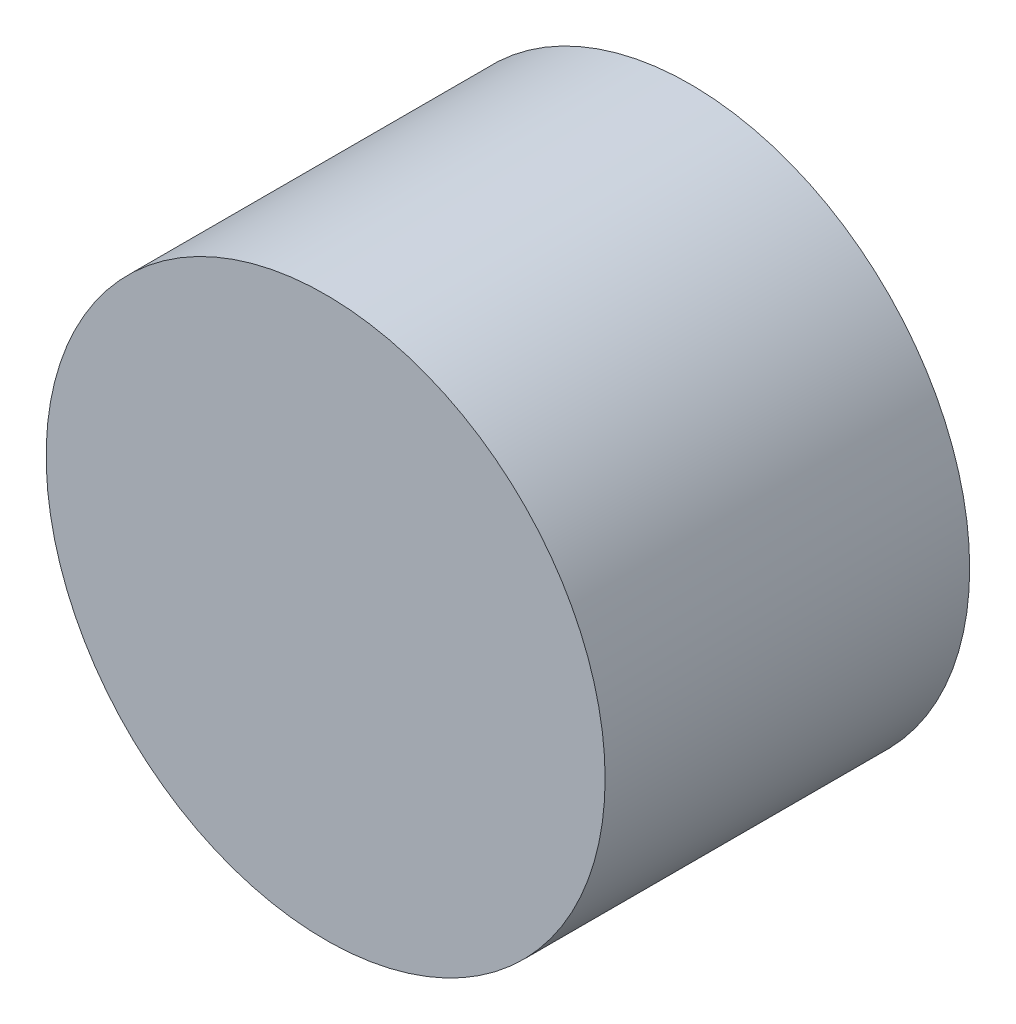
ISO-10303-21;
HEADER;
FILE_DESCRIPTION(('STEP AP214'),'2;1');
FILE_NAME('part.step','',(''),(''),'','','');
FILE_SCHEMA(('AUTOMOTIVE_DESIGN { 1 0 10303 214 1 1 1 1 }'));
ENDSEC;
DATA;
#1=APPLICATION_CONTEXT('core data for automotive mechanical design processes');
#2=APPLICATION_PROTOCOL_DEFINITION('international standard','automotive_design',2000,#1);
#3=PRODUCT_CONTEXT('',#1,'mechanical');
#4=PRODUCT('Part','Part','',(#3));
#5=PRODUCT_RELATED_PRODUCT_CATEGORY('part','',(#4));
#6=PRODUCT_DEFINITION_FORMATION('','',#4);
#7=PRODUCT_DEFINITION_CONTEXT('part definition',#1,'design');
#8=PRODUCT_DEFINITION('design','',#6,#7);
#9=PRODUCT_DEFINITION_SHAPE('','',#8);
#10=(LENGTH_UNIT() NAMED_UNIT(*) SI_UNIT(.MILLI.,.METRE.));
#11=(NAMED_UNIT(*) PLANE_ANGLE_UNIT() SI_UNIT($,.RADIAN.));
#12=(NAMED_UNIT(*) SI_UNIT($,.STERADIAN.) SOLID_ANGLE_UNIT());
#13=UNCERTAINTY_MEASURE_WITH_UNIT(LENGTH_MEASURE(1.E-05),#10,'distance_accuracy_value','');
#14=(GEOMETRIC_REPRESENTATION_CONTEXT(3) GLOBAL_UNCERTAINTY_ASSIGNED_CONTEXT((#13)) GLOBAL_UNIT_ASSIGNED_CONTEXT((#10,
#11,#12)) REPRESENTATION_CONTEXT('',''));
#15=CARTESIAN_POINT('',(0.,0.,0.));
#16=DIRECTION('',(0.,0.,1.));
#17=DIRECTION('',(1.,0.,0.));
#18=AXIS2_PLACEMENT_3D('',#15,#16,#17);
#19=CARTESIAN_POINT('',(0.,0.,3.));
#20=DIRECTION('',(0.,0.,-1.));
#21=DIRECTION('',(-1.,0.,0.));
#22=AXIS2_PLACEMENT_3D('',#19,#20,#21);
#23=CYLINDRICAL_SURFACE('',#22,2.3);
#24=CARTESIAN_POINT('',(0.,0.,3.));
#25=DIRECTION('',(0.,0.,1.));
#26=DIRECTION('',(1.,0.,0.));
#27=AXIS2_PLACEMENT_3D('',#24,#25,#26);
#28=CIRCLE('',#27,2.3);
#29=CARTESIAN_POINT('',(2.3,0.,3.));
#30=VERTEX_POINT('',#29);
#31=EDGE_CURVE('E10',#30,#30,#28,.T.);
#32=ORIENTED_EDGE('',*,*,#31,.F.);
#33=EDGE_LOOP('',(#32));
#34=FACE_BOUND('',#33,.T.);
#35=CARTESIAN_POINT('',(0.,0.,0.));
#36=DIRECTION('',(0.,0.,1.));
#37=DIRECTION('',(1.,0.,0.));
#38=AXIS2_PLACEMENT_3D('',#35,#36,#37);
#39=CIRCLE('',#38,2.3);
#40=CARTESIAN_POINT('',(2.3,0.,0.));
#41=VERTEX_POINT('',#40);
#42=EDGE_CURVE('E39',#41,#41,#39,.T.);
#43=ORIENTED_EDGE('',*,*,#42,.T.);
#44=EDGE_LOOP('',(#43));
#45=FACE_BOUND('',#44,.T.);
#46=ADVANCED_FACE('F36',(#34,#45),#23,.T.);
#47=CARTESIAN_POINT('',(0.,0.,3.));
#48=DIRECTION('',(0.,0.,1.));
#49=DIRECTION('',(1.,0.,0.));
#50=AXIS2_PLACEMENT_3D('',#47,#48,#49);
#51=PLANE('',#50);
#52=ORIENTED_EDGE('',*,*,#31,.T.);
#53=EDGE_LOOP('',(#52));
#54=FACE_BOUND('',#53,.T.);
#55=ADVANCED_FACE('F51',(#54),#51,.T.);
#56=CARTESIAN_POINT('',(0.,0.,0.));
#57=DIRECTION('',(0.,0.,1.));
#58=DIRECTION('',(1.,0.,0.));
#59=AXIS2_PLACEMENT_3D('',#56,#57,#58);
#60=PLANE('',#59);
#61=ORIENTED_EDGE('',*,*,#42,.F.);
#62=EDGE_LOOP('',(#61));
#63=FACE_BOUND('',#62,.T.);
#64=ADVANCED_FACE('F49',(#63),#60,.F.);
#65=CLOSED_SHELL('',(#46,#55,#64));
#66=MANIFOLD_SOLID_BREP('B2',#65);
#67=ADVANCED_BREP_SHAPE_REPRESENTATION('',(#18,#66),#14);
#68=SHAPE_DEFINITION_REPRESENTATION(#9,#67);
ENDSEC;
END-ISO-10303-21;
